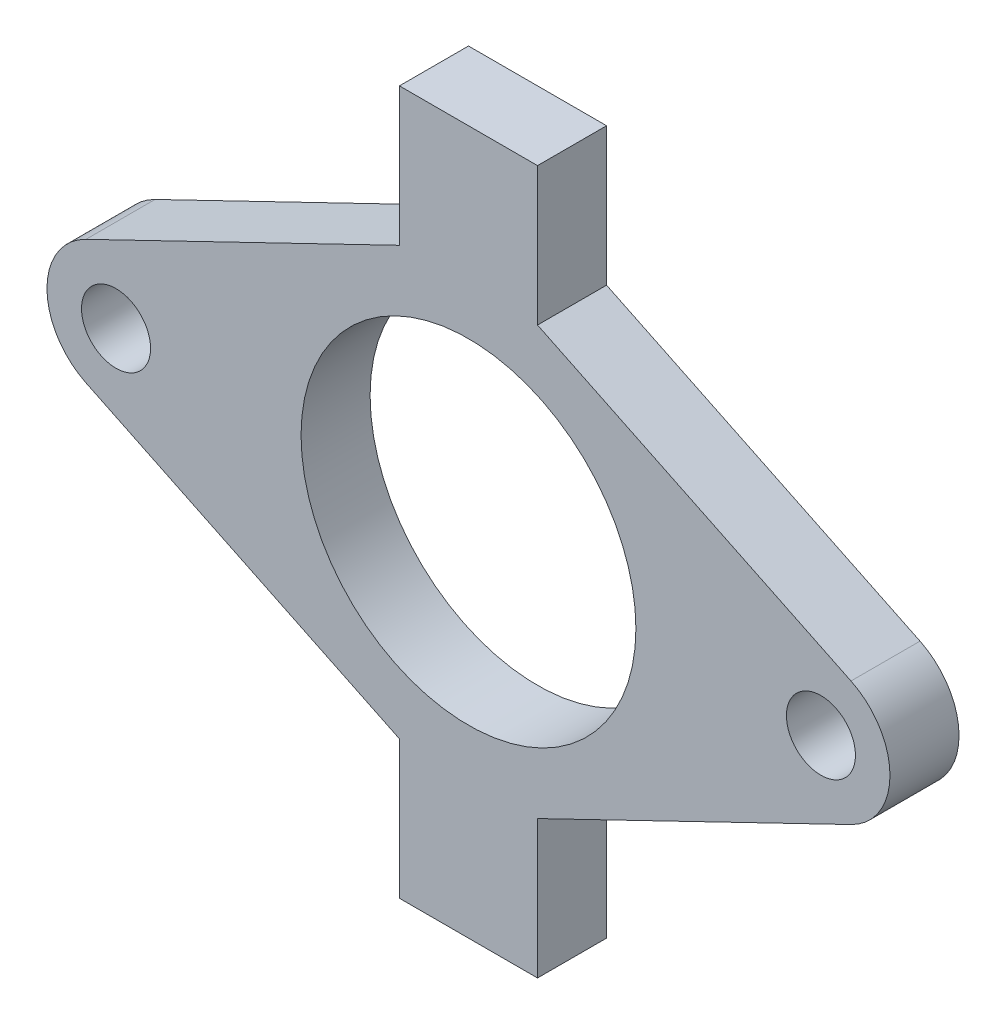
ISO-10303-21;
HEADER;
FILE_DESCRIPTION(('STEP AP214'),'2;1');
FILE_NAME('part.step','',(''),(''),'','','');
FILE_SCHEMA(('AUTOMOTIVE_DESIGN { 1 0 10303 214 1 1 1 1 }'));
ENDSEC;
DATA;
#1=APPLICATION_CONTEXT('core data for automotive mechanical design processes');
#2=APPLICATION_PROTOCOL_DEFINITION('international standard','automotive_design',2000,#1);
#3=PRODUCT_CONTEXT('',#1,'mechanical');
#4=PRODUCT('Part','Part','',(#3));
#5=PRODUCT_RELATED_PRODUCT_CATEGORY('part','',(#4));
#6=PRODUCT_DEFINITION_FORMATION('','',#4);
#7=PRODUCT_DEFINITION_CONTEXT('part definition',#1,'design');
#8=PRODUCT_DEFINITION('design','',#6,#7);
#9=PRODUCT_DEFINITION_SHAPE('','',#8);
#10=(LENGTH_UNIT() NAMED_UNIT(*) SI_UNIT(.MILLI.,.METRE.));
#11=(NAMED_UNIT(*) PLANE_ANGLE_UNIT() SI_UNIT($,.RADIAN.));
#12=(NAMED_UNIT(*) SI_UNIT($,.STERADIAN.) SOLID_ANGLE_UNIT());
#13=UNCERTAINTY_MEASURE_WITH_UNIT(LENGTH_MEASURE(1.E-05),#10,'distance_accuracy_value','');
#14=(GEOMETRIC_REPRESENTATION_CONTEXT(3) GLOBAL_UNCERTAINTY_ASSIGNED_CONTEXT((#13)) GLOBAL_UNIT_ASSIGNED_CONTEXT((#10,
#11,#12)) REPRESENTATION_CONTEXT('',''));
#15=CARTESIAN_POINT('',(0.,0.,0.));
#16=DIRECTION('',(0.,0.,1.));
#17=DIRECTION('',(1.,0.,0.));
#18=AXIS2_PLACEMENT_3D('',#15,#16,#17);
#19=CARTESIAN_POINT('',(9.99999999999999,-47.6506410256411,-10.));
#20=DIRECTION('',(1.,0.,0.));
#21=DIRECTION('',(0.,1.,0.));
#22=AXIS2_PLACEMENT_3D('',#19,#20,#21);
#23=PLANE('',#22);
#24=DIRECTION('',(0.,1.,0.));
#25=VECTOR('',#24,1.);
#26=CARTESIAN_POINT('',(9.99999999999999,-47.6506410256411,0.));
#27=LINE('',#26,#25);
#28=CARTESIAN_POINT('',(9.99999999999999,-47.6506410256411,0.));
#29=VERTEX_POINT('',#28);
#30=CARTESIAN_POINT('',(9.99999999999999,-27.650641025641,0.));
#31=VERTEX_POINT('',#30);
#32=EDGE_CURVE('E154',#29,#31,#27,.T.);
#33=ORIENTED_EDGE('',*,*,#32,.F.);
#34=DIRECTION('',(0.,0.,1.));
#35=VECTOR('',#34,1.);
#36=CARTESIAN_POINT('',(9.99999999999999,-47.6506410256411,-10.));
#37=LINE('',#36,#35);
#38=CARTESIAN_POINT('',(9.99999999999999,-47.6506410256411,-10.));
#39=VERTEX_POINT('',#38);
#40=EDGE_CURVE('E11',#39,#29,#37,.T.);
#41=ORIENTED_EDGE('',*,*,#40,.F.);
#42=DIRECTION('',(0.,1.,0.));
#43=VECTOR('',#42,1.);
#44=CARTESIAN_POINT('',(9.99999999999999,-47.6506410256411,-10.));
#45=LINE('',#44,#43);
#46=CARTESIAN_POINT('',(9.99999999999999,-27.650641025641,-10.));
#47=VERTEX_POINT('',#46);
#48=EDGE_CURVE('E187',#39,#47,#45,.T.);
#49=ORIENTED_EDGE('',*,*,#48,.T.);
#50=DIRECTION('',(0.,0.,1.));
#51=VECTOR('',#50,1.);
#52=CARTESIAN_POINT('',(9.99999999999999,-27.650641025641,-10.));
#53=LINE('',#52,#51);
#54=EDGE_CURVE('E36',#47,#31,#53,.T.);
#55=ORIENTED_EDGE('',*,*,#54,.T.);
#56=EDGE_LOOP('',(#33,#41,#49,#55));
#57=FACE_BOUND('',#56,.T.);
#58=ADVANCED_FACE('F33',(#57),#23,.T.);
#59=CARTESIAN_POINT('',(9.99999999999999,-47.6506410256411,-10.));
#60=DIRECTION('',(0.,-1.,0.));
#61=DIRECTION('',(0.,0.,-1.));
#62=AXIS2_PLACEMENT_3D('',#59,#60,#61);
#63=PLANE('',#62);
#64=DIRECTION('',(1.,0.,0.));
#65=VECTOR('',#64,1.);
#66=CARTESIAN_POINT('',(9.99999999999999,-47.6506410256411,0.));
#67=LINE('',#66,#65);
#68=CARTESIAN_POINT('',(-9.99999999999999,-47.6506410256411,0.));
#69=VERTEX_POINT('',#68);
#70=EDGE_CURVE('E185',#69,#29,#67,.T.);
#71=ORIENTED_EDGE('',*,*,#70,.F.);
#72=DIRECTION('',(0.,0.,1.));
#73=VECTOR('',#72,1.);
#74=CARTESIAN_POINT('',(-9.99999999999999,-47.6506410256411,-10.));
#75=LINE('',#74,#73);
#76=CARTESIAN_POINT('',(-9.99999999999999,-47.6506410256411,-10.));
#77=VERTEX_POINT('',#76);
#78=EDGE_CURVE('E42',#77,#69,#75,.T.);
#79=ORIENTED_EDGE('',*,*,#78,.F.);
#80=DIRECTION('',(1.,0.,0.));
#81=VECTOR('',#80,1.);
#82=CARTESIAN_POINT('',(9.99999999999999,-47.6506410256411,-10.));
#83=LINE('',#82,#81);
#84=EDGE_CURVE('E144',#77,#39,#83,.T.);
#85=ORIENTED_EDGE('',*,*,#84,.T.);
#86=ORIENTED_EDGE('',*,*,#40,.T.);
#87=EDGE_LOOP('',(#71,#79,#85,#86));
#88=FACE_BOUND('',#87,.T.);
#89=ADVANCED_FACE('F207',(#88),#63,.T.);
#90=CARTESIAN_POINT('',(-9.99999999999999,-47.6506410256411,-10.));
#91=DIRECTION('',(-1.,0.,0.));
#92=DIRECTION('',(0.,-1.,0.));
#93=AXIS2_PLACEMENT_3D('',#90,#91,#92);
#94=PLANE('',#93);
#95=DIRECTION('',(0.,-1.,0.));
#96=VECTOR('',#95,1.);
#97=CARTESIAN_POINT('',(-9.99999999999999,-47.6506410256411,0.));
#98=LINE('',#97,#96);
#99=CARTESIAN_POINT('',(-9.99999999999999,-27.650641025641,0.));
#100=VERTEX_POINT('',#99);
#101=EDGE_CURVE('E131',#100,#69,#98,.T.);
#102=ORIENTED_EDGE('',*,*,#101,.F.);
#103=DIRECTION('',(0.,0.,1.));
#104=VECTOR('',#103,1.);
#105=CARTESIAN_POINT('',(-9.99999999999999,-27.650641025641,-10.));
#106=LINE('',#105,#104);
#107=CARTESIAN_POINT('',(-9.99999999999999,-27.650641025641,-10.));
#108=VERTEX_POINT('',#107);
#109=EDGE_CURVE('E126',#108,#100,#106,.T.);
#110=ORIENTED_EDGE('',*,*,#109,.F.);
#111=DIRECTION('',(0.,-1.,0.));
#112=VECTOR('',#111,1.);
#113=CARTESIAN_POINT('',(-9.99999999999999,-47.6506410256411,-10.));
#114=LINE('',#113,#112);
#115=EDGE_CURVE('E129',#108,#77,#114,.T.);
#116=ORIENTED_EDGE('',*,*,#115,.T.);
#117=ORIENTED_EDGE('',*,*,#78,.T.);
#118=EDGE_LOOP('',(#102,#110,#116,#117));
#119=FACE_BOUND('',#118,.T.);
#120=ADVANCED_FACE('F128',(#119),#94,.T.);
#121=CARTESIAN_POINT('',(-9.99999999999999,-27.650641025641,-10.));
#122=DIRECTION('',(-0.435227541755653,-0.900320491212619,0.));
#123=DIRECTION('',(0.900320491212619,-0.435227541755653,0.));
#124=AXIS2_PLACEMENT_3D('',#121,#122,#123);
#125=PLANE('',#124);
#126=DIRECTION('',(0.900320491212619,-0.435227541755653,0.));
#127=VECTOR('',#126,1.);
#128=CARTESIAN_POINT('',(-9.99999999999999,-27.650641025641,0.));
#129=LINE('',#128,#127);
#130=CARTESIAN_POINT('',(-55.4002470032345,-5.7035254249468,0.));
#131=VERTEX_POINT('',#130);
#132=EDGE_CURVE('E182',#131,#100,#129,.T.);
#133=ORIENTED_EDGE('',*,*,#132,.F.);
#134=DIRECTION('',(0.,0.,1.));
#135=VECTOR('',#134,1.);
#136=CARTESIAN_POINT('',(-55.4002470032345,-5.7035254249468,-10.));
#137=LINE('',#136,#135);
#138=CARTESIAN_POINT('',(-55.4002470032345,-5.7035254249468,-10.));
#139=VERTEX_POINT('',#138);
#140=EDGE_CURVE('E136',#139,#131,#137,.T.);
#141=ORIENTED_EDGE('',*,*,#140,.F.);
#142=DIRECTION('',(0.900320491212619,-0.435227541755653,0.));
#143=VECTOR('',#142,1.);
#144=CARTESIAN_POINT('',(-9.99999999999999,-27.650641025641,-10.));
#145=LINE('',#144,#143);
#146=EDGE_CURVE('E142',#139,#108,#145,.T.);
#147=ORIENTED_EDGE('',*,*,#146,.T.);
#148=ORIENTED_EDGE('',*,*,#109,.T.);
#149=EDGE_LOOP('',(#133,#141,#147,#148));
#150=FACE_BOUND('',#149,.T.);
#151=ADVANCED_FACE('F146',(#150),#125,.T.);
#152=CARTESIAN_POINT('',(-51.0479715856781,3.29967948717947,-10.));
#153=DIRECTION('',(0.,0.,1.));
#154=DIRECTION('',(1.,0.,0.));
#155=AXIS2_PLACEMENT_3D('',#152,#153,#154);
#156=CYLINDRICAL_SURFACE('',#155,10.);
#157=CARTESIAN_POINT('',(-51.0479715856781,3.29967948717947,0.));
#158=DIRECTION('',(0.,0.,1.));
#159=DIRECTION('',(1.,0.,0.));
#160=AXIS2_PLACEMENT_3D('',#157,#158,#159);
#161=CIRCLE('',#160,10.);
#162=CARTESIAN_POINT('',(-55.4002470032345,12.3028843993057,0.));
#163=VERTEX_POINT('',#162);
#164=EDGE_CURVE('E179',#163,#131,#161,.T.);
#165=ORIENTED_EDGE('',*,*,#164,.F.);
#166=DIRECTION('',(0.,0.,1.));
#167=VECTOR('',#166,1.);
#168=CARTESIAN_POINT('',(-55.4002470032345,12.3028843993057,-10.));
#169=LINE('',#168,#167);
#170=CARTESIAN_POINT('',(-55.4002470032345,12.3028843993057,-10.));
#171=VERTEX_POINT('',#170);
#172=EDGE_CURVE('E191',#171,#163,#169,.T.);
#173=ORIENTED_EDGE('',*,*,#172,.F.);
#174=CARTESIAN_POINT('',(-51.0479715856781,3.29967948717947,-10.));
#175=DIRECTION('',(0.,0.,1.));
#176=DIRECTION('',(1.,0.,0.));
#177=AXIS2_PLACEMENT_3D('',#174,#175,#176);
#178=CIRCLE('',#177,10.);
#179=EDGE_CURVE('E147',#171,#139,#178,.T.);
#180=ORIENTED_EDGE('',*,*,#179,.T.);
#181=ORIENTED_EDGE('',*,*,#140,.T.);
#182=EDGE_LOOP('',(#165,#173,#180,#181));
#183=FACE_BOUND('',#182,.T.);
#184=ADVANCED_FACE('F220',(#183),#156,.T.);
#185=CARTESIAN_POINT('',(-10.,34.25,-10.));
#186=DIRECTION('',(-0.435227541755653,0.900320491212619,0.));
#187=DIRECTION('',(-0.900320491212619,-0.435227541755653,0.));
#188=AXIS2_PLACEMENT_3D('',#185,#186,#187);
#189=PLANE('',#188);
#190=DIRECTION('',(-0.900320491212619,-0.435227541755653,0.));
#191=VECTOR('',#190,1.);
#192=CARTESIAN_POINT('',(-10.,34.25,0.));
#193=LINE('',#192,#191);
#194=CARTESIAN_POINT('',(-10.,34.25,0.));
#195=VERTEX_POINT('',#194);
#196=EDGE_CURVE('E176',#195,#163,#193,.T.);
#197=ORIENTED_EDGE('',*,*,#196,.F.);
#198=DIRECTION('',(0.,0.,1.));
#199=VECTOR('',#198,1.);
#200=CARTESIAN_POINT('',(-10.,34.25,-10.));
#201=LINE('',#200,#199);
#202=CARTESIAN_POINT('',(-10.,34.25,-10.));
#203=VERTEX_POINT('',#202);
#204=EDGE_CURVE('E193',#203,#195,#201,.T.);
#205=ORIENTED_EDGE('',*,*,#204,.F.);
#206=DIRECTION('',(-0.900320491212619,-0.435227541755653,0.));
#207=VECTOR('',#206,1.);
#208=CARTESIAN_POINT('',(-10.,34.25,-10.));
#209=LINE('',#208,#207);
#210=EDGE_CURVE('E149',#203,#171,#209,.T.);
#211=ORIENTED_EDGE('',*,*,#210,.T.);
#212=ORIENTED_EDGE('',*,*,#172,.T.);
#213=EDGE_LOOP('',(#197,#205,#211,#212));
#214=FACE_BOUND('',#213,.T.);
#215=ADVANCED_FACE('F223',(#214),#189,.T.);
#216=CARTESIAN_POINT('',(-10.,54.25,-10.));
#217=DIRECTION('',(-1.,0.,0.));
#218=DIRECTION('',(0.,0.,1.));
#219=AXIS2_PLACEMENT_3D('',#216,#217,#218);
#220=PLANE('',#219);
#221=DIRECTION('',(0.,-1.,0.));
#222=VECTOR('',#221,1.);
#223=CARTESIAN_POINT('',(-10.,54.25,0.));
#224=LINE('',#223,#222);
#225=CARTESIAN_POINT('',(-10.,54.25,0.));
#226=VERTEX_POINT('',#225);
#227=EDGE_CURVE('E173',#226,#195,#224,.T.);
#228=ORIENTED_EDGE('',*,*,#227,.F.);
#229=DIRECTION('',(0.,0.,1.));
#230=VECTOR('',#229,1.);
#231=CARTESIAN_POINT('',(-10.,54.25,-10.));
#232=LINE('',#231,#230);
#233=CARTESIAN_POINT('',(-10.,54.25,-10.));
#234=VERTEX_POINT('',#233);
#235=EDGE_CURVE('E195',#234,#226,#232,.T.);
#236=ORIENTED_EDGE('',*,*,#235,.F.);
#237=DIRECTION('',(0.,-1.,0.));
#238=VECTOR('',#237,1.);
#239=CARTESIAN_POINT('',(-10.,54.25,-10.));
#240=LINE('',#239,#238);
#241=EDGE_CURVE('E307',#234,#203,#240,.T.);
#242=ORIENTED_EDGE('',*,*,#241,.T.);
#243=ORIENTED_EDGE('',*,*,#204,.T.);
#244=EDGE_LOOP('',(#228,#236,#242,#243));
#245=FACE_BOUND('',#244,.T.);
#246=ADVANCED_FACE('F227',(#245),#220,.T.);
#247=CARTESIAN_POINT('',(10.,54.25,-10.));
#248=DIRECTION('',(0.,1.,0.));
#249=DIRECTION('',(0.,0.,1.));
#250=AXIS2_PLACEMENT_3D('',#247,#248,#249);
#251=PLANE('',#250);
#252=DIRECTION('',(-1.,0.,0.));
#253=VECTOR('',#252,1.);
#254=CARTESIAN_POINT('',(10.,54.25,0.));
#255=LINE('',#254,#253);
#256=CARTESIAN_POINT('',(10.,54.25,0.));
#257=VERTEX_POINT('',#256);
#258=EDGE_CURVE('E170',#257,#226,#255,.T.);
#259=ORIENTED_EDGE('',*,*,#258,.F.);
#260=DIRECTION('',(0.,0.,1.));
#261=VECTOR('',#260,1.);
#262=CARTESIAN_POINT('',(10.,54.25,-10.));
#263=LINE('',#262,#261);
#264=CARTESIAN_POINT('',(10.,54.25,-10.));
#265=VERTEX_POINT('',#264);
#266=EDGE_CURVE('E197',#265,#257,#263,.T.);
#267=ORIENTED_EDGE('',*,*,#266,.F.);
#268=DIRECTION('',(-1.,0.,0.));
#269=VECTOR('',#268,1.);
#270=CARTESIAN_POINT('',(10.,54.25,-10.));
#271=LINE('',#270,#269);
#272=EDGE_CURVE('E304',#265,#234,#271,.T.);
#273=ORIENTED_EDGE('',*,*,#272,.T.);
#274=ORIENTED_EDGE('',*,*,#235,.T.);
#275=EDGE_LOOP('',(#259,#267,#273,#274));
#276=FACE_BOUND('',#275,.T.);
#277=ADVANCED_FACE('F231',(#276),#251,.T.);
#278=CARTESIAN_POINT('',(10.,54.25,-10.));
#279=DIRECTION('',(1.,0.,0.));
#280=DIRECTION('',(0.,0.,-1.));
#281=AXIS2_PLACEMENT_3D('',#278,#279,#280);
#282=PLANE('',#281);
#283=DIRECTION('',(0.,1.,0.));
#284=VECTOR('',#283,1.);
#285=CARTESIAN_POINT('',(10.,54.25,0.));
#286=LINE('',#285,#284);
#287=CARTESIAN_POINT('',(10.,34.25,0.));
#288=VERTEX_POINT('',#287);
#289=EDGE_CURVE('E167',#288,#257,#286,.T.);
#290=ORIENTED_EDGE('',*,*,#289,.F.);
#291=DIRECTION('',(0.,0.,1.));
#292=VECTOR('',#291,1.);
#293=CARTESIAN_POINT('',(10.,34.25,-10.));
#294=LINE('',#293,#292);
#295=CARTESIAN_POINT('',(10.,34.25,-10.));
#296=VERTEX_POINT('',#295);
#297=EDGE_CURVE('E199',#296,#288,#294,.T.);
#298=ORIENTED_EDGE('',*,*,#297,.F.);
#299=DIRECTION('',(0.,1.,0.));
#300=VECTOR('',#299,1.);
#301=CARTESIAN_POINT('',(10.,54.25,-10.));
#302=LINE('',#301,#300);
#303=EDGE_CURVE('E301',#296,#265,#302,.T.);
#304=ORIENTED_EDGE('',*,*,#303,.T.);
#305=ORIENTED_EDGE('',*,*,#266,.T.);
#306=EDGE_LOOP('',(#290,#298,#304,#305));
#307=FACE_BOUND('',#306,.T.);
#308=ADVANCED_FACE('F235',(#307),#282,.T.);
#309=CARTESIAN_POINT('',(10.,34.25,-10.));
#310=DIRECTION('',(0.435227541755653,0.900320491212619,0.));
#311=DIRECTION('',(-0.900320491212619,0.435227541755653,0.));
#312=AXIS2_PLACEMENT_3D('',#309,#310,#311);
#313=PLANE('',#312);
#314=DIRECTION('',(-0.900320491212619,0.435227541755653,0.));
#315=VECTOR('',#314,1.);
#316=CARTESIAN_POINT('',(10.,34.25,0.));
#317=LINE('',#316,#315);
#318=CARTESIAN_POINT('',(55.4002470032345,12.3028843993057,0.));
#319=VERTEX_POINT('',#318);
#320=EDGE_CURVE('E164',#319,#288,#317,.T.);
#321=ORIENTED_EDGE('',*,*,#320,.F.);
#322=DIRECTION('',(0.,0.,1.));
#323=VECTOR('',#322,1.);
#324=CARTESIAN_POINT('',(55.4002470032345,12.3028843993057,-10.));
#325=LINE('',#324,#323);
#326=CARTESIAN_POINT('',(55.4002470032345,12.3028843993057,-10.));
#327=VERTEX_POINT('',#326);
#328=EDGE_CURVE('E201',#327,#319,#325,.T.);
#329=ORIENTED_EDGE('',*,*,#328,.F.);
#330=DIRECTION('',(-0.900320491212619,0.435227541755653,0.));
#331=VECTOR('',#330,1.);
#332=CARTESIAN_POINT('',(10.,34.25,-10.));
#333=LINE('',#332,#331);
#334=EDGE_CURVE('E298',#327,#296,#333,.T.);
#335=ORIENTED_EDGE('',*,*,#334,.T.);
#336=ORIENTED_EDGE('',*,*,#297,.T.);
#337=EDGE_LOOP('',(#321,#329,#335,#336));
#338=FACE_BOUND('',#337,.T.);
#339=ADVANCED_FACE('F239',(#338),#313,.T.);
#340=CARTESIAN_POINT('',(51.0479715856781,3.29967948717947,-10.));
#341=DIRECTION('',(0.,0.,1.));
#342=DIRECTION('',(1.,0.,0.));
#343=AXIS2_PLACEMENT_3D('',#340,#341,#342);
#344=CYLINDRICAL_SURFACE('',#343,10.);
#345=CARTESIAN_POINT('',(51.0479715856781,3.29967948717947,0.));
#346=DIRECTION('',(0.,0.,1.));
#347=DIRECTION('',(-1.,0.,0.));
#348=AXIS2_PLACEMENT_3D('',#345,#346,#347);
#349=CIRCLE('',#348,10.);
#350=CARTESIAN_POINT('',(55.4002470032345,-5.7035254249468,0.));
#351=VERTEX_POINT('',#350);
#352=EDGE_CURVE('E161',#351,#319,#349,.T.);
#353=ORIENTED_EDGE('',*,*,#352,.F.);
#354=DIRECTION('',(0.,0.,1.));
#355=VECTOR('',#354,1.);
#356=CARTESIAN_POINT('',(55.4002470032345,-5.7035254249468,-10.));
#357=LINE('',#356,#355);
#358=CARTESIAN_POINT('',(55.4002470032345,-5.7035254249468,-10.));
#359=VERTEX_POINT('',#358);
#360=EDGE_CURVE('E202',#359,#351,#357,.T.);
#361=ORIENTED_EDGE('',*,*,#360,.F.);
#362=CARTESIAN_POINT('',(51.0479715856781,3.29967948717947,-10.));
#363=DIRECTION('',(0.,0.,1.));
#364=DIRECTION('',(-1.,0.,0.));
#365=AXIS2_PLACEMENT_3D('',#362,#363,#364);
#366=CIRCLE('',#365,10.);
#367=EDGE_CURVE('E295',#359,#327,#366,.T.);
#368=ORIENTED_EDGE('',*,*,#367,.T.);
#369=ORIENTED_EDGE('',*,*,#328,.T.);
#370=EDGE_LOOP('',(#353,#361,#368,#369));
#371=FACE_BOUND('',#370,.T.);
#372=ADVANCED_FACE('F243',(#371),#344,.T.);
#373=CARTESIAN_POINT('',(9.99999999999999,-27.650641025641,-10.));
#374=DIRECTION('',(0.435227541755653,-0.900320491212619,0.));
#375=DIRECTION('',(0.900320491212619,0.435227541755653,0.));
#376=AXIS2_PLACEMENT_3D('',#373,#374,#375);
#377=PLANE('',#376);
#378=DIRECTION('',(0.900320491212619,0.435227541755653,0.));
#379=VECTOR('',#378,1.);
#380=CARTESIAN_POINT('',(9.99999999999999,-27.650641025641,0.));
#381=LINE('',#380,#379);
#382=EDGE_CURVE('E157',#31,#351,#381,.T.);
#383=ORIENTED_EDGE('',*,*,#382,.F.);
#384=ORIENTED_EDGE('',*,*,#54,.F.);
#385=DIRECTION('',(0.900320491212619,0.435227541755653,0.));
#386=VECTOR('',#385,1.);
#387=CARTESIAN_POINT('',(9.99999999999999,-27.650641025641,-10.));
#388=LINE('',#387,#386);
#389=EDGE_CURVE('E293',#47,#359,#388,.T.);
#390=ORIENTED_EDGE('',*,*,#389,.T.);
#391=ORIENTED_EDGE('',*,*,#360,.T.);
#392=EDGE_LOOP('',(#383,#384,#390,#391));
#393=FACE_BOUND('',#392,.T.);
#394=ADVANCED_FACE('F204',(#393),#377,.T.);
#395=CARTESIAN_POINT('',(51.0479715856781,3.29967948717947,-10.));
#396=DIRECTION('',(0.,0.,-1.));
#397=DIRECTION('',(-1.,0.,0.));
#398=AXIS2_PLACEMENT_3D('',#395,#396,#397);
#399=PLANE('',#398);
#400=CARTESIAN_POINT('',(0.,3.29967948717947,-10.));
#401=DIRECTION('',(0.,0.,1.));
#402=DIRECTION('',(1.,0.,0.));
#403=AXIS2_PLACEMENT_3D('',#400,#401,#402);
#404=CIRCLE('',#403,24.25);
#405=CARTESIAN_POINT('',(24.25,3.29967948717947,-10.));
#406=VERTEX_POINT('',#405);
#407=EDGE_CURVE('E274',#406,#406,#404,.T.);
#408=ORIENTED_EDGE('',*,*,#407,.T.);
#409=EDGE_LOOP('',(#408));
#410=FACE_BOUND('',#409,.T.);
#411=CARTESIAN_POINT('',(-51.0479715856781,3.29967948717947,-10.));
#412=DIRECTION('',(0.,0.,1.));
#413=DIRECTION('',(1.,0.,0.));
#414=AXIS2_PLACEMENT_3D('',#411,#412,#413);
#415=CIRCLE('',#414,5.);
#416=CARTESIAN_POINT('',(-46.0479715856781,3.29967948717947,-10.));
#417=VERTEX_POINT('',#416);
#418=EDGE_CURVE('E282',#417,#417,#415,.T.);
#419=ORIENTED_EDGE('',*,*,#418,.T.);
#420=EDGE_LOOP('',(#419));
#421=FACE_BOUND('',#420,.T.);
#422=CARTESIAN_POINT('',(51.0479715856781,3.29967948717947,-10.));
#423=DIRECTION('',(0.,0.,1.));
#424=DIRECTION('',(1.,0.,0.));
#425=AXIS2_PLACEMENT_3D('',#422,#423,#424);
#426=CIRCLE('',#425,5.);
#427=CARTESIAN_POINT('',(56.0479715856781,3.29967948717947,-10.));
#428=VERTEX_POINT('',#427);
#429=EDGE_CURVE('E158',#428,#428,#426,.T.);
#430=ORIENTED_EDGE('',*,*,#429,.T.);
#431=EDGE_LOOP('',(#430));
#432=FACE_BOUND('',#431,.T.);
#433=ORIENTED_EDGE('',*,*,#48,.F.);
#434=ORIENTED_EDGE('',*,*,#84,.F.);
#435=ORIENTED_EDGE('',*,*,#115,.F.);
#436=ORIENTED_EDGE('',*,*,#146,.F.);
#437=ORIENTED_EDGE('',*,*,#179,.F.);
#438=ORIENTED_EDGE('',*,*,#210,.F.);
#439=ORIENTED_EDGE('',*,*,#241,.F.);
#440=ORIENTED_EDGE('',*,*,#272,.F.);
#441=ORIENTED_EDGE('',*,*,#303,.F.);
#442=ORIENTED_EDGE('',*,*,#334,.F.);
#443=ORIENTED_EDGE('',*,*,#367,.F.);
#444=ORIENTED_EDGE('',*,*,#389,.F.);
#445=EDGE_LOOP('',(#433,#434,#435,#436,#437,#438,#439,#440,#441,#442,#443,#444));
#446=FACE_BOUND('',#445,.T.);
#447=ADVANCED_FACE('F140',(#410,#421,#432,#446),#399,.T.);
#448=CARTESIAN_POINT('',(51.0479715856781,3.29967948717947,0.));
#449=DIRECTION('',(0.,0.,-1.));
#450=DIRECTION('',(-1.,0.,0.));
#451=AXIS2_PLACEMENT_3D('',#448,#449,#450);
#452=PLANE('',#451);
#453=CARTESIAN_POINT('',(0.,3.29967948717947,0.));
#454=DIRECTION('',(0.,0.,1.));
#455=DIRECTION('',(1.,0.,0.));
#456=AXIS2_PLACEMENT_3D('',#453,#454,#455);
#457=CIRCLE('',#456,24.25);
#458=CARTESIAN_POINT('',(24.25,3.29967948717947,0.));
#459=VERTEX_POINT('',#458);
#460=EDGE_CURVE('E277',#459,#459,#457,.T.);
#461=ORIENTED_EDGE('',*,*,#460,.F.);
#462=EDGE_LOOP('',(#461));
#463=FACE_BOUND('',#462,.T.);
#464=CARTESIAN_POINT('',(-51.0479715856781,3.29967948717947,0.));
#465=DIRECTION('',(0.,0.,1.));
#466=DIRECTION('',(1.,0.,0.));
#467=AXIS2_PLACEMENT_3D('',#464,#465,#466);
#468=CIRCLE('',#467,5.);
#469=CARTESIAN_POINT('',(-46.0479715856781,3.29967948717947,0.));
#470=VERTEX_POINT('',#469);
#471=EDGE_CURVE('E279',#470,#470,#468,.T.);
#472=ORIENTED_EDGE('',*,*,#471,.F.);
#473=EDGE_LOOP('',(#472));
#474=FACE_BOUND('',#473,.T.);
#475=CARTESIAN_POINT('',(51.0479715856781,3.29967948717947,0.));
#476=DIRECTION('',(0.,0.,1.));
#477=DIRECTION('',(1.,0.,0.));
#478=AXIS2_PLACEMENT_3D('',#475,#476,#477);
#479=CIRCLE('',#478,5.);
#480=CARTESIAN_POINT('',(56.0479715856781,3.29967948717947,0.));
#481=VERTEX_POINT('',#480);
#482=EDGE_CURVE('E285',#481,#481,#479,.T.);
#483=ORIENTED_EDGE('',*,*,#482,.F.);
#484=EDGE_LOOP('',(#483));
#485=FACE_BOUND('',#484,.T.);
#486=ORIENTED_EDGE('',*,*,#32,.T.);
#487=ORIENTED_EDGE('',*,*,#382,.T.);
#488=ORIENTED_EDGE('',*,*,#352,.T.);
#489=ORIENTED_EDGE('',*,*,#320,.T.);
#490=ORIENTED_EDGE('',*,*,#289,.T.);
#491=ORIENTED_EDGE('',*,*,#258,.T.);
#492=ORIENTED_EDGE('',*,*,#227,.T.);
#493=ORIENTED_EDGE('',*,*,#196,.T.);
#494=ORIENTED_EDGE('',*,*,#164,.T.);
#495=ORIENTED_EDGE('',*,*,#132,.T.);
#496=ORIENTED_EDGE('',*,*,#101,.T.);
#497=ORIENTED_EDGE('',*,*,#70,.T.);
#498=EDGE_LOOP('',(#486,#487,#488,#489,#490,#491,#492,#493,#494,#495,#496,#497));
#499=FACE_BOUND('',#498,.T.);
#500=ADVANCED_FACE('F206',(#463,#474,#485,#499),#452,.F.);
#501=CARTESIAN_POINT('',(51.0479715856781,3.29967948717947,-10.));
#502=DIRECTION('',(0.,0.,1.));
#503=DIRECTION('',(1.,0.,0.));
#504=AXIS2_PLACEMENT_3D('',#501,#502,#503);
#505=CYLINDRICAL_SURFACE('',#504,5.);
#506=ORIENTED_EDGE('',*,*,#429,.F.);
#507=EDGE_LOOP('',(#506));
#508=FACE_BOUND('',#507,.T.);
#509=ORIENTED_EDGE('',*,*,#482,.T.);
#510=EDGE_LOOP('',(#509));
#511=FACE_BOUND('',#510,.T.);
#512=ADVANCED_FACE('F255',(#508,#511),#505,.F.);
#513=CARTESIAN_POINT('',(-51.0479715856781,3.29967948717947,-10.));
#514=DIRECTION('',(0.,0.,1.));
#515=DIRECTION('',(1.,0.,0.));
#516=AXIS2_PLACEMENT_3D('',#513,#514,#515);
#517=CYLINDRICAL_SURFACE('',#516,5.);
#518=ORIENTED_EDGE('',*,*,#418,.F.);
#519=EDGE_LOOP('',(#518));
#520=FACE_BOUND('',#519,.T.);
#521=ORIENTED_EDGE('',*,*,#471,.T.);
#522=EDGE_LOOP('',(#521));
#523=FACE_BOUND('',#522,.T.);
#524=ADVANCED_FACE('F262',(#520,#523),#517,.F.);
#525=CARTESIAN_POINT('',(0.,3.29967948717947,-10.));
#526=DIRECTION('',(0.,0.,1.));
#527=DIRECTION('',(1.,0.,0.));
#528=AXIS2_PLACEMENT_3D('',#525,#526,#527);
#529=CYLINDRICAL_SURFACE('',#528,24.25);
#530=ORIENTED_EDGE('',*,*,#407,.F.);
#531=EDGE_LOOP('',(#530));
#532=FACE_BOUND('',#531,.T.);
#533=ORIENTED_EDGE('',*,*,#460,.T.);
#534=EDGE_LOOP('',(#533));
#535=FACE_BOUND('',#534,.T.);
#536=ADVANCED_FACE('F266',(#532,#535),#529,.F.);
#537=CLOSED_SHELL('',(#58,#89,#120,#151,#184,#215,#246,#277,#308,#339,#372,#394,#447,#500,#512,
#524,#536));
#538=MANIFOLD_SOLID_BREP('B2',#537);
#539=ADVANCED_BREP_SHAPE_REPRESENTATION('',(#18,#538),#14);
#540=SHAPE_DEFINITION_REPRESENTATION(#9,#539);
ENDSEC;
END-ISO-10303-21;
